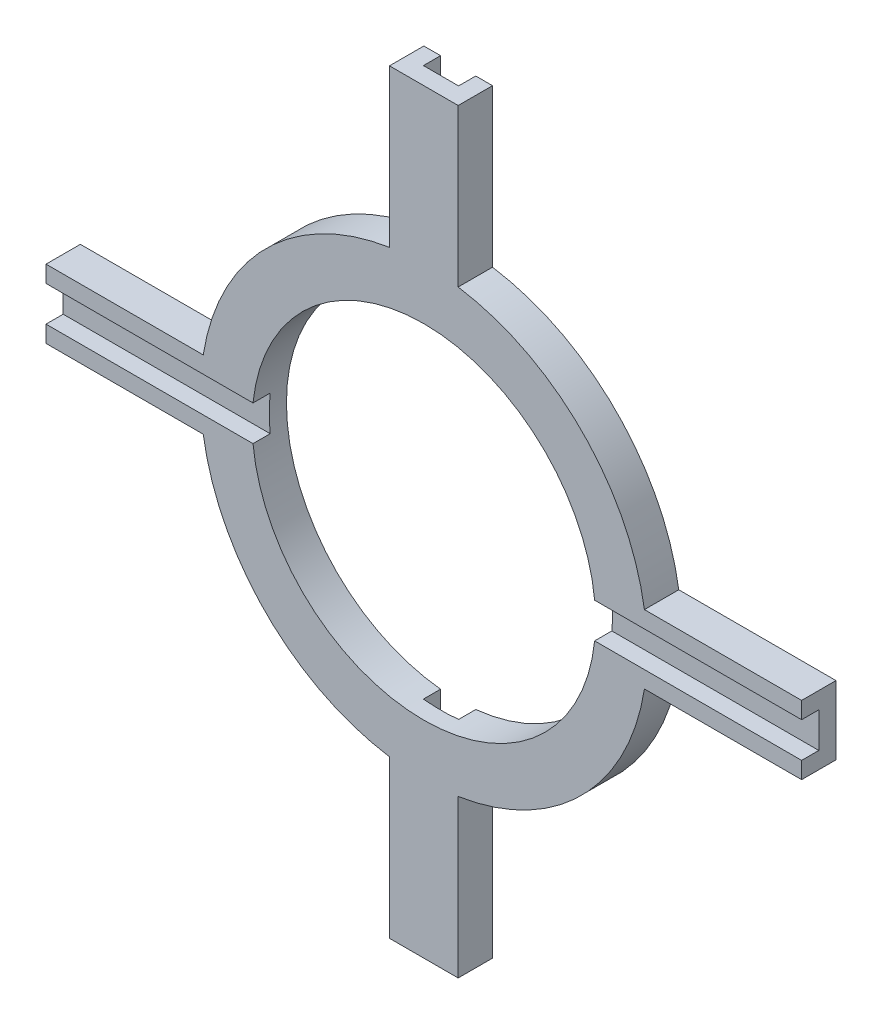
ISO-10303-21;
HEADER;
FILE_DESCRIPTION(('STEP AP214'),'2;1');
FILE_NAME('part.step','',(''),(''),'','','');
FILE_SCHEMA(('AUTOMOTIVE_DESIGN { 1 0 10303 214 1 1 1 1 }'));
ENDSEC;
DATA;
#1=APPLICATION_CONTEXT('core data for automotive mechanical design processes');
#2=APPLICATION_PROTOCOL_DEFINITION('international standard','automotive_design',2000,#1);
#3=PRODUCT_CONTEXT('',#1,'mechanical');
#4=PRODUCT('Part','Part','',(#3));
#5=PRODUCT_RELATED_PRODUCT_CATEGORY('part','',(#4));
#6=PRODUCT_DEFINITION_FORMATION('','',#4);
#7=PRODUCT_DEFINITION_CONTEXT('part definition',#1,'design');
#8=PRODUCT_DEFINITION('design','',#6,#7);
#9=PRODUCT_DEFINITION_SHAPE('','',#8);
#10=(LENGTH_UNIT() NAMED_UNIT(*) SI_UNIT(.MILLI.,.METRE.));
#11=(NAMED_UNIT(*) PLANE_ANGLE_UNIT() SI_UNIT($,.RADIAN.));
#12=(NAMED_UNIT(*) SI_UNIT($,.STERADIAN.) SOLID_ANGLE_UNIT());
#13=UNCERTAINTY_MEASURE_WITH_UNIT(LENGTH_MEASURE(1.E-05),#10,'distance_accuracy_value','');
#14=(GEOMETRIC_REPRESENTATION_CONTEXT(3) GLOBAL_UNCERTAINTY_ASSIGNED_CONTEXT((#13)) GLOBAL_UNIT_ASSIGNED_CONTEXT((#10,
#11,#12)) REPRESENTATION_CONTEXT('',''));
#15=CARTESIAN_POINT('',(0.,0.,0.));
#16=DIRECTION('',(0.,0.,1.));
#17=DIRECTION('',(1.,0.,0.));
#18=AXIS2_PLACEMENT_3D('',#15,#16,#17);
#19=CARTESIAN_POINT('',(0.,0.,4.));
#20=DIRECTION('',(0.,0.,1.));
#21=DIRECTION('',(1.,0.,0.));
#22=AXIS2_PLACEMENT_3D('',#19,#20,#21);
#23=PLANE('',#22);
#24=DIRECTION('',(1.,0.,0.));
#25=VECTOR('',#24,1.);
#26=CARTESIAN_POINT('',(-45.,-2.05,4.));
#27=LINE('',#26,#25);
#28=CARTESIAN_POINT('',(-44.,-2.05,4.));
#29=VERTEX_POINT('',#28);
#30=CARTESIAN_POINT('',(-19.8946600875712,-2.05,4.));
#31=VERTEX_POINT('',#30);
#32=EDGE_CURVE('E583',#29,#31,#27,.T.);
#33=ORIENTED_EDGE('',*,*,#32,.F.);
#34=DIRECTION('',(0.,-1.,0.));
#35=VECTOR('',#34,1.);
#36=CARTESIAN_POINT('',(-44.,-4.,4.));
#37=LINE('',#36,#35);
#38=CARTESIAN_POINT('',(-44.,-4.,4.));
#39=VERTEX_POINT('',#38);
#40=EDGE_CURVE('E359',#29,#39,#37,.T.);
#41=ORIENTED_EDGE('',*,*,#40,.T.);
#42=DIRECTION('',(1.,0.,0.));
#43=VECTOR('',#42,1.);
#44=CARTESIAN_POINT('',(-44.,-4.,4.));
#45=LINE('',#44,#43);
#46=CARTESIAN_POINT('',(-25.6904651573303,-4.,4.));
#47=VERTEX_POINT('',#46);
#48=EDGE_CURVE('E360',#39,#47,#45,.T.);
#49=ORIENTED_EDGE('',*,*,#48,.T.);
#50=CARTESIAN_POINT('',(0.,0.,4.));
#51=DIRECTION('',(0.,0.,1.));
#52=DIRECTION('',(1.,0.,0.));
#53=AXIS2_PLACEMENT_3D('',#50,#51,#52);
#54=CIRCLE('',#53,26.);
#55=CARTESIAN_POINT('',(-4.,-25.6904651573303,4.));
#56=VERTEX_POINT('',#55);
#57=EDGE_CURVE('E396',#47,#56,#54,.T.);
#58=ORIENTED_EDGE('',*,*,#57,.T.);
#59=DIRECTION('',(0.,-1.,0.));
#60=VECTOR('',#59,1.);
#61=CARTESIAN_POINT('',(-4.,-44.,4.));
#62=LINE('',#61,#60);
#63=CARTESIAN_POINT('',(-4.,-44.,4.));
#64=VERTEX_POINT('',#63);
#65=EDGE_CURVE('E320',#56,#64,#62,.T.);
#66=ORIENTED_EDGE('',*,*,#65,.T.);
#67=DIRECTION('',(1.,0.,0.));
#68=VECTOR('',#67,1.);
#69=CARTESIAN_POINT('',(-4.,-44.,4.));
#70=LINE('',#69,#68);
#71=CARTESIAN_POINT('',(4.,-44.,4.));
#72=VERTEX_POINT('',#71);
#73=EDGE_CURVE('E318',#64,#72,#70,.T.);
#74=ORIENTED_EDGE('',*,*,#73,.T.);
#75=DIRECTION('',(0.,1.,0.));
#76=VECTOR('',#75,1.);
#77=CARTESIAN_POINT('',(4.,-44.,4.));
#78=LINE('',#77,#76);
#79=CARTESIAN_POINT('',(4.,-25.6904651573303,4.));
#80=VERTEX_POINT('',#79);
#81=EDGE_CURVE('E321',#72,#80,#78,.T.);
#82=ORIENTED_EDGE('',*,*,#81,.T.);
#83=CARTESIAN_POINT('',(25.6904651573303,-4.,4.));
#84=VERTEX_POINT('',#83);
#85=EDGE_CURVE('E402',#80,#84,#54,.T.);
#86=ORIENTED_EDGE('',*,*,#85,.T.);
#87=DIRECTION('',(1.,0.,0.));
#88=VECTOR('',#87,1.);
#89=CARTESIAN_POINT('',(24.,-4.,4.));
#90=LINE('',#89,#88);
#91=CARTESIAN_POINT('',(44.,-4.,4.));
#92=VERTEX_POINT('',#91);
#93=EDGE_CURVE('E276',#84,#92,#90,.T.);
#94=ORIENTED_EDGE('',*,*,#93,.T.);
#95=DIRECTION('',(0.,1.,0.));
#96=VECTOR('',#95,1.);
#97=CARTESIAN_POINT('',(44.,-4.,4.));
#98=LINE('',#97,#96);
#99=CARTESIAN_POINT('',(44.,-2.05,4.));
#100=VERTEX_POINT('',#99);
#101=EDGE_CURVE('E279',#92,#100,#98,.T.);
#102=ORIENTED_EDGE('',*,*,#101,.T.);
#103=CARTESIAN_POINT('',(19.8946600875712,-2.05,4.));
#104=VERTEX_POINT('',#103);
#105=EDGE_CURVE('E435',#104,#100,#27,.T.);
#106=ORIENTED_EDGE('',*,*,#105,.F.);
#107=CARTESIAN_POINT('',(0.,0.,4.));
#108=DIRECTION('',(0.,0.,1.));
#109=DIRECTION('',(1.,0.,0.));
#110=AXIS2_PLACEMENT_3D('',#107,#108,#109);
#111=CIRCLE('',#110,20.);
#112=EDGE_CURVE('E393',#31,#104,#111,.T.);
#113=ORIENTED_EDGE('',*,*,#112,.F.);
#114=EDGE_LOOP('',(#33,#41,#49,#58,#66,#74,#82,#86,#94,#102,#106,#113));
#115=FACE_BOUND('',#114,.T.);
#116=ADVANCED_FACE('F41',(#115),#23,.T.);
#117=CARTESIAN_POINT('',(0.,0.,0.));
#118=DIRECTION('',(0.,0.,1.));
#119=DIRECTION('',(1.,0.,0.));
#120=AXIS2_PLACEMENT_3D('',#117,#118,#119);
#121=PLANE('',#120);
#122=DIRECTION('',(0.,1.,0.));
#123=VECTOR('',#122,1.);
#124=CARTESIAN_POINT('',(-2.05,45.,0.));
#125=LINE('',#124,#123);
#126=CARTESIAN_POINT('',(-2.05,-44.,0.));
#127=VERTEX_POINT('',#126);
#128=CARTESIAN_POINT('',(-2.05,-19.8946600875712,0.));
#129=VERTEX_POINT('',#128);
#130=EDGE_CURVE('E609',#127,#129,#125,.T.);
#131=ORIENTED_EDGE('',*,*,#130,.F.);
#132=DIRECTION('',(1.,0.,0.));
#133=VECTOR('',#132,1.);
#134=CARTESIAN_POINT('',(-4.,-44.,0.));
#135=LINE('',#134,#133);
#136=CARTESIAN_POINT('',(-4.,-44.,0.));
#137=VERTEX_POINT('',#136);
#138=EDGE_CURVE('E335',#137,#127,#135,.T.);
#139=ORIENTED_EDGE('',*,*,#138,.F.);
#140=DIRECTION('',(0.,-1.,0.));
#141=VECTOR('',#140,1.);
#142=CARTESIAN_POINT('',(-4.,-44.,0.));
#143=LINE('',#142,#141);
#144=CARTESIAN_POINT('',(-4.,-25.6904651573303,0.));
#145=VERTEX_POINT('',#144);
#146=EDGE_CURVE('E317',#145,#137,#143,.T.);
#147=ORIENTED_EDGE('',*,*,#146,.F.);
#148=CARTESIAN_POINT('',(0.,0.,0.));
#149=DIRECTION('',(0.,0.,1.));
#150=DIRECTION('',(1.,0.,0.));
#151=AXIS2_PLACEMENT_3D('',#148,#149,#150);
#152=CIRCLE('',#151,26.);
#153=CARTESIAN_POINT('',(-25.6904651573303,-4.,0.));
#154=VERTEX_POINT('',#153);
#155=EDGE_CURVE('E401',#154,#145,#152,.T.);
#156=ORIENTED_EDGE('',*,*,#155,.F.);
#157=DIRECTION('',(1.,0.,0.));
#158=VECTOR('',#157,1.);
#159=CARTESIAN_POINT('',(-44.,-4.,0.));
#160=LINE('',#159,#158);
#161=CARTESIAN_POINT('',(-44.,-4.,0.));
#162=VERTEX_POINT('',#161);
#163=EDGE_CURVE('E371',#162,#154,#160,.T.);
#164=ORIENTED_EDGE('',*,*,#163,.F.);
#165=DIRECTION('',(0.,-1.,0.));
#166=VECTOR('',#165,1.);
#167=CARTESIAN_POINT('',(-44.,-4.,0.));
#168=LINE('',#167,#166);
#169=CARTESIAN_POINT('',(-44.,4.,0.));
#170=VERTEX_POINT('',#169);
#171=EDGE_CURVE('E353',#170,#162,#168,.T.);
#172=ORIENTED_EDGE('',*,*,#171,.F.);
#173=DIRECTION('',(-1.,0.,0.));
#174=VECTOR('',#173,1.);
#175=CARTESIAN_POINT('',(-44.,4.,0.));
#176=LINE('',#175,#174);
#177=CARTESIAN_POINT('',(-25.6904651573303,4.,0.));
#178=VERTEX_POINT('',#177);
#179=EDGE_CURVE('E374',#178,#170,#176,.T.);
#180=ORIENTED_EDGE('',*,*,#179,.F.);
#181=CARTESIAN_POINT('',(-4.,25.6904651573303,0.));
#182=VERTEX_POINT('',#181);
#183=EDGE_CURVE('E388',#182,#178,#152,.T.);
#184=ORIENTED_EDGE('',*,*,#183,.F.);
#185=DIRECTION('',(0.,-1.,0.));
#186=VECTOR('',#185,1.);
#187=CARTESIAN_POINT('',(-4.,24.,0.));
#188=LINE('',#187,#186);
#189=CARTESIAN_POINT('',(-4.,44.,0.));
#190=VERTEX_POINT('',#189);
#191=EDGE_CURVE('E477',#190,#182,#188,.T.);
#192=ORIENTED_EDGE('',*,*,#191,.F.);
#193=DIRECTION('',(-1.,0.,0.));
#194=VECTOR('',#193,1.);
#195=CARTESIAN_POINT('',(-4.,44.,0.));
#196=LINE('',#195,#194);
#197=CARTESIAN_POINT('',(-2.05,44.,0.));
#198=VERTEX_POINT('',#197);
#199=EDGE_CURVE('E486',#198,#190,#196,.T.);
#200=ORIENTED_EDGE('',*,*,#199,.F.);
#201=CARTESIAN_POINT('',(-2.05,19.8946600875712,0.));
#202=VERTEX_POINT('',#201);
#203=EDGE_CURVE('E614',#202,#198,#125,.T.);
#204=ORIENTED_EDGE('',*,*,#203,.F.);
#205=CARTESIAN_POINT('',(0.,0.,0.));
#206=DIRECTION('',(0.,0.,1.));
#207=DIRECTION('',(1.,0.,0.));
#208=AXIS2_PLACEMENT_3D('',#205,#206,#207);
#209=CIRCLE('',#208,20.);
#210=EDGE_CURVE('E392',#202,#129,#209,.T.);
#211=ORIENTED_EDGE('',*,*,#210,.T.);
#212=EDGE_LOOP('',(#131,#139,#147,#156,#164,#172,#180,#184,#192,#200,#204,#211));
#213=FACE_BOUND('',#212,.T.);
#214=ADVANCED_FACE('F511',(#213),#121,.F.);
#215=DIRECTION('',(0.,-1.,0.));
#216=VECTOR('',#215,1.);
#217=CARTESIAN_POINT('',(2.05,-45.,0.));
#218=LINE('',#217,#216);
#219=CARTESIAN_POINT('',(2.05,44.,0.));
#220=VERTEX_POINT('',#219);
#221=CARTESIAN_POINT('',(2.05,19.8946600875712,0.));
#222=VERTEX_POINT('',#221);
#223=EDGE_CURVE('E619',#220,#222,#218,.T.);
#224=ORIENTED_EDGE('',*,*,#223,.F.);
#225=CARTESIAN_POINT('',(4.,44.,0.));
#226=VERTEX_POINT('',#225);
#227=EDGE_CURVE('E478',#226,#220,#196,.T.);
#228=ORIENTED_EDGE('',*,*,#227,.F.);
#229=DIRECTION('',(0.,1.,0.));
#230=VECTOR('',#229,1.);
#231=CARTESIAN_POINT('',(4.,24.,0.));
#232=LINE('',#231,#230);
#233=CARTESIAN_POINT('',(4.,25.6904651573303,0.));
#234=VERTEX_POINT('',#233);
#235=EDGE_CURVE('E483',#234,#226,#232,.T.);
#236=ORIENTED_EDGE('',*,*,#235,.F.);
#237=CARTESIAN_POINT('',(25.6904651573303,4.,0.));
#238=VERTEX_POINT('',#237);
#239=EDGE_CURVE('E449',#238,#234,#152,.T.);
#240=ORIENTED_EDGE('',*,*,#239,.F.);
#241=DIRECTION('',(-1.,0.,0.));
#242=VECTOR('',#241,1.);
#243=CARTESIAN_POINT('',(24.,4.,0.));
#244=LINE('',#243,#242);
#245=CARTESIAN_POINT('',(44.,4.,0.));
#246=VERTEX_POINT('',#245);
#247=EDGE_CURVE('E286',#246,#238,#244,.T.);
#248=ORIENTED_EDGE('',*,*,#247,.F.);
#249=DIRECTION('',(0.,1.,0.));
#250=VECTOR('',#249,1.);
#251=CARTESIAN_POINT('',(44.,-4.,0.));
#252=LINE('',#251,#250);
#253=CARTESIAN_POINT('',(44.,-4.,0.));
#254=VERTEX_POINT('',#253);
#255=EDGE_CURVE('E294',#254,#246,#252,.T.);
#256=ORIENTED_EDGE('',*,*,#255,.F.);
#257=DIRECTION('',(1.,0.,0.));
#258=VECTOR('',#257,1.);
#259=CARTESIAN_POINT('',(24.,-4.,0.));
#260=LINE('',#259,#258);
#261=CARTESIAN_POINT('',(25.6904651573303,-4.,0.));
#262=VERTEX_POINT('',#261);
#263=EDGE_CURVE('E292',#262,#254,#260,.T.);
#264=ORIENTED_EDGE('',*,*,#263,.F.);
#265=CARTESIAN_POINT('',(4.,-25.6904651573303,0.));
#266=VERTEX_POINT('',#265);
#267=EDGE_CURVE('E407',#266,#262,#152,.T.);
#268=ORIENTED_EDGE('',*,*,#267,.F.);
#269=DIRECTION('',(0.,1.,0.));
#270=VECTOR('',#269,1.);
#271=CARTESIAN_POINT('',(4.,-44.,0.));
#272=LINE('',#271,#270);
#273=CARTESIAN_POINT('',(4.,-44.,0.));
#274=VERTEX_POINT('',#273);
#275=EDGE_CURVE('E322',#274,#266,#272,.T.);
#276=ORIENTED_EDGE('',*,*,#275,.F.);
#277=CARTESIAN_POINT('',(2.05,-44.,0.));
#278=VERTEX_POINT('',#277);
#279=EDGE_CURVE('E331',#278,#274,#135,.T.);
#280=ORIENTED_EDGE('',*,*,#279,.F.);
#281=CARTESIAN_POINT('',(2.05,-19.8946600875712,0.));
#282=VERTEX_POINT('',#281);
#283=EDGE_CURVE('E613',#282,#278,#218,.T.);
#284=ORIENTED_EDGE('',*,*,#283,.F.);
#285=EDGE_CURVE('E383',#282,#222,#209,.T.);
#286=ORIENTED_EDGE('',*,*,#285,.T.);
#287=EDGE_LOOP('',(#224,#228,#236,#240,#248,#256,#264,#268,#276,#280,#284,#286));
#288=FACE_BOUND('',#287,.T.);
#289=ADVANCED_FACE('F443',(#288),#121,.F.);
#290=CARTESIAN_POINT('',(0.,0.,4.));
#291=DIRECTION('',(0.,0.,-1.));
#292=DIRECTION('',(-1.,0.,0.));
#293=AXIS2_PLACEMENT_3D('',#290,#291,#292);
#294=CYLINDRICAL_SURFACE('',#293,26.);
#295=DIRECTION('',(0.,0.,-1.));
#296=VECTOR('',#295,1.);
#297=CARTESIAN_POINT('',(-4.,25.6904651573303,4.));
#298=LINE('',#297,#296);
#299=CARTESIAN_POINT('',(-4.,25.6904651573303,4.));
#300=VERTEX_POINT('',#299);
#301=EDGE_CURVE('E298',#182,#300,#298,.F.);
#302=ORIENTED_EDGE('',*,*,#301,.F.);
#303=ORIENTED_EDGE('',*,*,#183,.T.);
#304=DIRECTION('',(0.,0.,-1.));
#305=VECTOR('',#304,1.);
#306=CARTESIAN_POINT('',(-25.6904651573303,4.,4.));
#307=LINE('',#306,#305);
#308=CARTESIAN_POINT('',(-25.6904651573303,4.,4.));
#309=VERTEX_POINT('',#308);
#310=EDGE_CURVE('E399',#309,#178,#307,.T.);
#311=ORIENTED_EDGE('',*,*,#310,.F.);
#312=EDGE_CURVE('E405',#300,#309,#54,.T.);
#313=ORIENTED_EDGE('',*,*,#312,.F.);
#314=EDGE_LOOP('',(#302,#303,#311,#313));
#315=FACE_BOUND('',#314,.T.);
#316=ADVANCED_FACE('F734',(#315),#294,.T.);
#317=DIRECTION('',(0.,0.,-1.));
#318=VECTOR('',#317,1.);
#319=CARTESIAN_POINT('',(4.,25.6904651573303,4.));
#320=LINE('',#319,#318);
#321=CARTESIAN_POINT('',(4.,25.6904651573303,4.));
#322=VERTEX_POINT('',#321);
#323=EDGE_CURVE('E465',#322,#234,#320,.T.);
#324=ORIENTED_EDGE('',*,*,#323,.F.);
#325=CARTESIAN_POINT('',(25.6904651573303,4.,4.));
#326=VERTEX_POINT('',#325);
#327=EDGE_CURVE('E454',#326,#322,#54,.T.);
#328=ORIENTED_EDGE('',*,*,#327,.F.);
#329=DIRECTION('',(0.,0.,-1.));
#330=VECTOR('',#329,1.);
#331=CARTESIAN_POINT('',(25.6904651573303,4.,4.));
#332=LINE('',#331,#330);
#333=EDGE_CURVE('E308',#238,#326,#332,.F.);
#334=ORIENTED_EDGE('',*,*,#333,.F.);
#335=ORIENTED_EDGE('',*,*,#239,.T.);
#336=EDGE_LOOP('',(#324,#328,#334,#335));
#337=FACE_BOUND('',#336,.T.);
#338=ADVANCED_FACE('F739',(#337),#294,.T.);
#339=DIRECTION('',(0.,0.,-1.));
#340=VECTOR('',#339,1.);
#341=CARTESIAN_POINT('',(25.6904651573303,-4.,4.));
#342=LINE('',#341,#340);
#343=EDGE_CURVE('E315',#84,#262,#342,.T.);
#344=ORIENTED_EDGE('',*,*,#343,.F.);
#345=ORIENTED_EDGE('',*,*,#85,.F.);
#346=DIRECTION('',(0.,0.,-1.));
#347=VECTOR('',#346,1.);
#348=CARTESIAN_POINT('',(4.,-25.6904651573303,4.));
#349=LINE('',#348,#347);
#350=EDGE_CURVE('E348',#266,#80,#349,.F.);
#351=ORIENTED_EDGE('',*,*,#350,.F.);
#352=ORIENTED_EDGE('',*,*,#267,.T.);
#353=EDGE_LOOP('',(#344,#345,#351,#352));
#354=FACE_BOUND('',#353,.T.);
#355=ADVANCED_FACE('F522',(#354),#294,.T.);
#356=DIRECTION('',(0.,0.,-1.));
#357=VECTOR('',#356,1.);
#358=CARTESIAN_POINT('',(-4.,-25.6904651573303,4.));
#359=LINE('',#358,#357);
#360=EDGE_CURVE('E347',#56,#145,#359,.T.);
#361=ORIENTED_EDGE('',*,*,#360,.F.);
#362=ORIENTED_EDGE('',*,*,#57,.F.);
#363=DIRECTION('',(0.,0.,-1.));
#364=VECTOR('',#363,1.);
#365=CARTESIAN_POINT('',(-25.6904651573303,-4.,4.));
#366=LINE('',#365,#364);
#367=EDGE_CURVE('E408',#154,#47,#366,.F.);
#368=ORIENTED_EDGE('',*,*,#367,.F.);
#369=ORIENTED_EDGE('',*,*,#155,.T.);
#370=EDGE_LOOP('',(#361,#362,#368,#369));
#371=FACE_BOUND('',#370,.T.);
#372=ADVANCED_FACE('F43',(#371),#294,.T.);
#373=DIRECTION('',(-1.,0.,0.));
#374=VECTOR('',#373,1.);
#375=CARTESIAN_POINT('',(45.,2.05,4.));
#376=LINE('',#375,#374);
#377=CARTESIAN_POINT('',(44.,2.05,4.));
#378=VERTEX_POINT('',#377);
#379=CARTESIAN_POINT('',(19.8946600875712,2.05,4.));
#380=VERTEX_POINT('',#379);
#381=EDGE_CURVE('E691',#378,#380,#376,.T.);
#382=ORIENTED_EDGE('',*,*,#381,.F.);
#383=CARTESIAN_POINT('',(44.,4.,4.));
#384=VERTEX_POINT('',#383);
#385=EDGE_CURVE('E272',#378,#384,#98,.T.);
#386=ORIENTED_EDGE('',*,*,#385,.T.);
#387=DIRECTION('',(-1.,0.,0.));
#388=VECTOR('',#387,1.);
#389=CARTESIAN_POINT('',(24.,4.,4.));
#390=LINE('',#389,#388);
#391=EDGE_CURVE('E282',#384,#326,#390,.T.);
#392=ORIENTED_EDGE('',*,*,#391,.T.);
#393=ORIENTED_EDGE('',*,*,#327,.T.);
#394=DIRECTION('',(0.,1.,0.));
#395=VECTOR('',#394,1.);
#396=CARTESIAN_POINT('',(4.,24.,4.));
#397=LINE('',#396,#395);
#398=CARTESIAN_POINT('',(4.,44.,4.));
#399=VERTEX_POINT('',#398);
#400=EDGE_CURVE('E453',#322,#399,#397,.T.);
#401=ORIENTED_EDGE('',*,*,#400,.T.);
#402=DIRECTION('',(-1.,0.,0.));
#403=VECTOR('',#402,1.);
#404=CARTESIAN_POINT('',(-4.,44.,4.));
#405=LINE('',#404,#403);
#406=CARTESIAN_POINT('',(-4.,44.,4.));
#407=VERTEX_POINT('',#406);
#408=EDGE_CURVE('E470',#399,#407,#405,.T.);
#409=ORIENTED_EDGE('',*,*,#408,.T.);
#410=DIRECTION('',(0.,-1.,0.));
#411=VECTOR('',#410,1.);
#412=CARTESIAN_POINT('',(-4.,24.,4.));
#413=LINE('',#412,#411);
#414=EDGE_CURVE('E466',#407,#300,#413,.T.);
#415=ORIENTED_EDGE('',*,*,#414,.T.);
#416=ORIENTED_EDGE('',*,*,#312,.T.);
#417=DIRECTION('',(-1.,0.,0.));
#418=VECTOR('',#417,1.);
#419=CARTESIAN_POINT('',(-44.,4.,4.));
#420=LINE('',#419,#418);
#421=CARTESIAN_POINT('',(-44.,4.,4.));
#422=VERTEX_POINT('',#421);
#423=EDGE_CURVE('E364',#309,#422,#420,.T.);
#424=ORIENTED_EDGE('',*,*,#423,.T.);
#425=CARTESIAN_POINT('',(-44.,2.05,4.));
#426=VERTEX_POINT('',#425);
#427=EDGE_CURVE('E354',#422,#426,#37,.T.);
#428=ORIENTED_EDGE('',*,*,#427,.T.);
#429=CARTESIAN_POINT('',(-19.8946600875712,2.05,4.));
#430=VERTEX_POINT('',#429);
#431=EDGE_CURVE('E587',#430,#426,#376,.T.);
#432=ORIENTED_EDGE('',*,*,#431,.F.);
#433=EDGE_CURVE('E387',#380,#430,#111,.T.);
#434=ORIENTED_EDGE('',*,*,#433,.F.);
#435=EDGE_LOOP('',(#382,#386,#392,#393,#401,#409,#415,#416,#424,#428,#432,#434));
#436=FACE_BOUND('',#435,.T.);
#437=ADVANCED_FACE('F455',(#436),#23,.T.);
#438=CARTESIAN_POINT('',(0.,0.,4.));
#439=DIRECTION('',(0.,0.,-1.));
#440=DIRECTION('',(-1.,0.,0.));
#441=AXIS2_PLACEMENT_3D('',#438,#439,#440);
#442=CYLINDRICAL_SURFACE('',#441,20.);
#443=DIRECTION('',(0.,0.,-1.));
#444=VECTOR('',#443,1.);
#445=CARTESIAN_POINT('',(-19.8946600875712,2.05,4.));
#446=LINE('',#445,#444);
#447=CARTESIAN_POINT('',(-19.8946600875712,2.05,2.));
#448=VERTEX_POINT('',#447);
#449=EDGE_CURVE('E673',#448,#430,#446,.F.);
#450=ORIENTED_EDGE('',*,*,#449,.F.);
#451=CARTESIAN_POINT('',(0.,0.,2.));
#452=DIRECTION('',(0.,0.,1.));
#453=DIRECTION('',(1.,0.,0.));
#454=AXIS2_PLACEMENT_3D('',#451,#452,#453);
#455=CIRCLE('',#454,20.);
#456=CARTESIAN_POINT('',(-19.8946600875712,-2.05,2.));
#457=VERTEX_POINT('',#456);
#458=EDGE_CURVE('E685',#448,#457,#455,.T.);
#459=ORIENTED_EDGE('',*,*,#458,.T.);
#460=DIRECTION('',(0.,0.,-1.));
#461=VECTOR('',#460,1.);
#462=CARTESIAN_POINT('',(-19.8946600875712,-2.05,4.));
#463=LINE('',#462,#461);
#464=EDGE_CURVE('E581',#31,#457,#463,.T.);
#465=ORIENTED_EDGE('',*,*,#464,.F.);
#466=ORIENTED_EDGE('',*,*,#112,.T.);
#467=DIRECTION('',(0.,0.,-1.));
#468=VECTOR('',#467,1.);
#469=CARTESIAN_POINT('',(19.8946600875712,-2.05,4.));
#470=LINE('',#469,#468);
#471=CARTESIAN_POINT('',(19.8946600875712,-2.05,2.));
#472=VERTEX_POINT('',#471);
#473=EDGE_CURVE('E585',#472,#104,#470,.F.);
#474=ORIENTED_EDGE('',*,*,#473,.F.);
#475=CARTESIAN_POINT('',(19.8946600875712,2.05,2.));
#476=VERTEX_POINT('',#475);
#477=EDGE_CURVE('E684',#472,#476,#455,.T.);
#478=ORIENTED_EDGE('',*,*,#477,.T.);
#479=DIRECTION('',(0.,0.,-1.));
#480=VECTOR('',#479,1.);
#481=CARTESIAN_POINT('',(19.8946600875712,2.05,4.));
#482=LINE('',#481,#480);
#483=EDGE_CURVE('E264',#380,#476,#482,.T.);
#484=ORIENTED_EDGE('',*,*,#483,.F.);
#485=ORIENTED_EDGE('',*,*,#433,.T.);
#486=EDGE_LOOP('',(#450,#459,#465,#466,#474,#478,#484,#485));
#487=FACE_BOUND('',#486,.T.);
#488=DIRECTION('',(0.,0.,-1.));
#489=VECTOR('',#488,1.);
#490=CARTESIAN_POINT('',(-2.05,19.8946600875712,4.));
#491=LINE('',#490,#489);
#492=CARTESIAN_POINT('',(-2.05,19.8946600875712,2.));
#493=VERTEX_POINT('',#492);
#494=EDGE_CURVE('E484',#493,#202,#491,.T.);
#495=ORIENTED_EDGE('',*,*,#494,.F.);
#496=CARTESIAN_POINT('',(0.,0.,2.));
#497=DIRECTION('',(0.,0.,1.));
#498=DIRECTION('',(1.,0.,0.));
#499=AXIS2_PLACEMENT_3D('',#496,#497,#498);
#500=CIRCLE('',#499,20.);
#501=CARTESIAN_POINT('',(2.05,19.8946600875712,2.));
#502=VERTEX_POINT('',#501);
#503=EDGE_CURVE('E633',#502,#493,#500,.T.);
#504=ORIENTED_EDGE('',*,*,#503,.F.);
#505=DIRECTION('',(0.,0.,-1.));
#506=VECTOR('',#505,1.);
#507=CARTESIAN_POINT('',(2.05,19.8946600875712,4.));
#508=LINE('',#507,#506);
#509=EDGE_CURVE('E636',#222,#502,#508,.F.);
#510=ORIENTED_EDGE('',*,*,#509,.F.);
#511=ORIENTED_EDGE('',*,*,#285,.F.);
#512=DIRECTION('',(0.,0.,-1.));
#513=VECTOR('',#512,1.);
#514=CARTESIAN_POINT('',(2.05,-19.8946600875712,4.));
#515=LINE('',#514,#513);
#516=CARTESIAN_POINT('',(2.05,-19.8946600875712,2.));
#517=VERTEX_POINT('',#516);
#518=EDGE_CURVE('E638',#517,#282,#515,.T.);
#519=ORIENTED_EDGE('',*,*,#518,.F.);
#520=CARTESIAN_POINT('',(-2.05,-19.8946600875712,2.));
#521=VERTEX_POINT('',#520);
#522=EDGE_CURVE('E627',#521,#517,#500,.T.);
#523=ORIENTED_EDGE('',*,*,#522,.F.);
#524=DIRECTION('',(0.,0.,-1.));
#525=VECTOR('',#524,1.);
#526=CARTESIAN_POINT('',(-2.05,-19.8946600875712,4.));
#527=LINE('',#526,#525);
#528=EDGE_CURVE('E641',#129,#521,#527,.F.);
#529=ORIENTED_EDGE('',*,*,#528,.F.);
#530=ORIENTED_EDGE('',*,*,#210,.F.);
#531=EDGE_LOOP('',(#495,#504,#510,#511,#519,#523,#529,#530));
#532=FACE_BOUND('',#531,.T.);
#533=ADVANCED_FACE('F578',(#487,#532),#442,.F.);
#534=CARTESIAN_POINT('',(-44.,-4.,4.));
#535=DIRECTION('',(0.,1.,0.));
#536=DIRECTION('',(0.,0.,1.));
#537=AXIS2_PLACEMENT_3D('',#534,#535,#536);
#538=PLANE('',#537);
#539=ORIENTED_EDGE('',*,*,#163,.T.);
#540=ORIENTED_EDGE('',*,*,#367,.T.);
#541=ORIENTED_EDGE('',*,*,#48,.F.);
#542=DIRECTION('',(0.,0.,-1.));
#543=VECTOR('',#542,1.);
#544=CARTESIAN_POINT('',(-44.,-4.,4.));
#545=LINE('',#544,#543);
#546=EDGE_CURVE('E382',#39,#162,#545,.T.);
#547=ORIENTED_EDGE('',*,*,#546,.T.);
#548=EDGE_LOOP('',(#539,#540,#541,#547));
#549=FACE_BOUND('',#548,.T.);
#550=ADVANCED_FACE('F599',(#549),#538,.F.);
#551=CARTESIAN_POINT('',(-44.,4.,4.));
#552=DIRECTION('',(0.,-1.,0.));
#553=DIRECTION('',(0.,0.,-1.));
#554=AXIS2_PLACEMENT_3D('',#551,#552,#553);
#555=PLANE('',#554);
#556=ORIENTED_EDGE('',*,*,#423,.F.);
#557=ORIENTED_EDGE('',*,*,#310,.T.);
#558=ORIENTED_EDGE('',*,*,#179,.T.);
#559=DIRECTION('',(0.,0.,-1.));
#560=VECTOR('',#559,1.);
#561=CARTESIAN_POINT('',(-44.,4.,4.));
#562=LINE('',#561,#560);
#563=EDGE_CURVE('E370',#422,#170,#562,.T.);
#564=ORIENTED_EDGE('',*,*,#563,.F.);
#565=EDGE_LOOP('',(#556,#557,#558,#564));
#566=FACE_BOUND('',#565,.T.);
#567=ADVANCED_FACE('F879',(#566),#555,.F.);
#568=CARTESIAN_POINT('',(-44.,-4.,4.));
#569=DIRECTION('',(1.,0.,0.));
#570=DIRECTION('',(0.,0.,-1.));
#571=AXIS2_PLACEMENT_3D('',#568,#569,#570);
#572=PLANE('',#571);
#573=DIRECTION('',(0.,-1.,0.));
#574=VECTOR('',#573,1.);
#575=CARTESIAN_POINT('',(-44.,-4.,2.));
#576=LINE('',#575,#574);
#577=CARTESIAN_POINT('',(-44.,2.05,2.));
#578=VERTEX_POINT('',#577);
#579=CARTESIAN_POINT('',(-44.,-2.05,2.));
#580=VERTEX_POINT('',#579);
#581=EDGE_CURVE('E266',#578,#580,#576,.T.);
#582=ORIENTED_EDGE('',*,*,#581,.F.);
#583=DIRECTION('',(0.,0.,1.));
#584=VECTOR('',#583,1.);
#585=CARTESIAN_POINT('',(-44.,2.05,4.));
#586=LINE('',#585,#584);
#587=EDGE_CURVE('E674',#578,#426,#586,.T.);
#588=ORIENTED_EDGE('',*,*,#587,.T.);
#589=ORIENTED_EDGE('',*,*,#427,.F.);
#590=ORIENTED_EDGE('',*,*,#563,.T.);
#591=ORIENTED_EDGE('',*,*,#171,.T.);
#592=ORIENTED_EDGE('',*,*,#546,.F.);
#593=ORIENTED_EDGE('',*,*,#40,.F.);
#594=DIRECTION('',(0.,0.,-1.));
#595=VECTOR('',#594,1.);
#596=CARTESIAN_POINT('',(-44.,-2.05,4.));
#597=LINE('',#596,#595);
#598=EDGE_CURVE('E600',#29,#580,#597,.T.);
#599=ORIENTED_EDGE('',*,*,#598,.T.);
#600=EDGE_LOOP('',(#582,#588,#589,#590,#591,#592,#593,#599));
#601=FACE_BOUND('',#600,.T.);
#602=ADVANCED_FACE('F597',(#601),#572,.F.);
#603=CARTESIAN_POINT('',(-4.,-44.,4.));
#604=DIRECTION('',(1.,0.,0.));
#605=DIRECTION('',(0.,0.,-1.));
#606=AXIS2_PLACEMENT_3D('',#603,#604,#605);
#607=PLANE('',#606);
#608=ORIENTED_EDGE('',*,*,#65,.F.);
#609=ORIENTED_EDGE('',*,*,#360,.T.);
#610=ORIENTED_EDGE('',*,*,#146,.T.);
#611=DIRECTION('',(0.,0.,-1.));
#612=VECTOR('',#611,1.);
#613=CARTESIAN_POINT('',(-4.,-44.,4.));
#614=LINE('',#613,#612);
#615=EDGE_CURVE('E345',#64,#137,#614,.T.);
#616=ORIENTED_EDGE('',*,*,#615,.F.);
#617=EDGE_LOOP('',(#608,#609,#610,#616));
#618=FACE_BOUND('',#617,.T.);
#619=ADVANCED_FACE('F604',(#618),#607,.F.);
#620=CARTESIAN_POINT('',(4.,-44.,4.));
#621=DIRECTION('',(-1.,0.,0.));
#622=DIRECTION('',(0.,0.,1.));
#623=AXIS2_PLACEMENT_3D('',#620,#621,#622);
#624=PLANE('',#623);
#625=ORIENTED_EDGE('',*,*,#275,.T.);
#626=ORIENTED_EDGE('',*,*,#350,.T.);
#627=ORIENTED_EDGE('',*,*,#81,.F.);
#628=DIRECTION('',(0.,0.,-1.));
#629=VECTOR('',#628,1.);
#630=CARTESIAN_POINT('',(4.,-44.,4.));
#631=LINE('',#630,#629);
#632=EDGE_CURVE('E326',#72,#274,#631,.T.);
#633=ORIENTED_EDGE('',*,*,#632,.T.);
#634=EDGE_LOOP('',(#625,#626,#627,#633));
#635=FACE_BOUND('',#634,.T.);
#636=ADVANCED_FACE('F528',(#635),#624,.F.);
#637=CARTESIAN_POINT('',(-4.,-44.,4.));
#638=DIRECTION('',(0.,1.,0.));
#639=DIRECTION('',(0.,0.,1.));
#640=AXIS2_PLACEMENT_3D('',#637,#638,#639);
#641=PLANE('',#640);
#642=ORIENTED_EDGE('',*,*,#138,.T.);
#643=DIRECTION('',(0.,0.,1.));
#644=VECTOR('',#643,1.);
#645=CARTESIAN_POINT('',(-2.05,-44.,4.));
#646=LINE('',#645,#644);
#647=CARTESIAN_POINT('',(-2.05,-44.,2.));
#648=VERTEX_POINT('',#647);
#649=EDGE_CURVE('E610',#127,#648,#646,.T.);
#650=ORIENTED_EDGE('',*,*,#649,.T.);
#651=DIRECTION('',(1.,0.,0.));
#652=VECTOR('',#651,1.);
#653=CARTESIAN_POINT('',(-4.,-44.,2.));
#654=LINE('',#653,#652);
#655=CARTESIAN_POINT('',(2.05,-44.,2.));
#656=VERTEX_POINT('',#655);
#657=EDGE_CURVE('E626',#648,#656,#654,.T.);
#658=ORIENTED_EDGE('',*,*,#657,.T.);
#659=DIRECTION('',(0.,0.,-1.));
#660=VECTOR('',#659,1.);
#661=CARTESIAN_POINT('',(2.05,-44.,4.));
#662=LINE('',#661,#660);
#663=EDGE_CURVE('E536',#656,#278,#662,.T.);
#664=ORIENTED_EDGE('',*,*,#663,.T.);
#665=ORIENTED_EDGE('',*,*,#279,.T.);
#666=ORIENTED_EDGE('',*,*,#632,.F.);
#667=ORIENTED_EDGE('',*,*,#73,.F.);
#668=ORIENTED_EDGE('',*,*,#615,.T.);
#669=EDGE_LOOP('',(#642,#650,#658,#664,#665,#666,#667,#668));
#670=FACE_BOUND('',#669,.T.);
#671=ADVANCED_FACE('F534',(#670),#641,.F.);
#672=CARTESIAN_POINT('',(24.,-4.,4.));
#673=DIRECTION('',(0.,1.,0.));
#674=DIRECTION('',(0.,0.,1.));
#675=AXIS2_PLACEMENT_3D('',#672,#673,#674);
#676=PLANE('',#675);
#677=ORIENTED_EDGE('',*,*,#93,.F.);
#678=ORIENTED_EDGE('',*,*,#343,.T.);
#679=ORIENTED_EDGE('',*,*,#263,.T.);
#680=DIRECTION('',(0.,0.,-1.));
#681=VECTOR('',#680,1.);
#682=CARTESIAN_POINT('',(44.,-4.,4.));
#683=LINE('',#682,#681);
#684=EDGE_CURVE('E302',#92,#254,#683,.T.);
#685=ORIENTED_EDGE('',*,*,#684,.F.);
#686=EDGE_LOOP('',(#677,#678,#679,#685));
#687=FACE_BOUND('',#686,.T.);
#688=ADVANCED_FACE('F438',(#687),#676,.F.);
#689=CARTESIAN_POINT('',(24.,4.,4.));
#690=DIRECTION('',(0.,-1.,0.));
#691=DIRECTION('',(0.,0.,-1.));
#692=AXIS2_PLACEMENT_3D('',#689,#690,#691);
#693=PLANE('',#692);
#694=ORIENTED_EDGE('',*,*,#247,.T.);
#695=ORIENTED_EDGE('',*,*,#333,.T.);
#696=ORIENTED_EDGE('',*,*,#391,.F.);
#697=DIRECTION('',(0.,0.,-1.));
#698=VECTOR('',#697,1.);
#699=CARTESIAN_POINT('',(44.,4.,4.));
#700=LINE('',#699,#698);
#701=EDGE_CURVE('E271',#384,#246,#700,.T.);
#702=ORIENTED_EDGE('',*,*,#701,.T.);
#703=EDGE_LOOP('',(#694,#695,#696,#702));
#704=FACE_BOUND('',#703,.T.);
#705=ADVANCED_FACE('F448',(#704),#693,.F.);
#706=CARTESIAN_POINT('',(44.,-4.,4.));
#707=DIRECTION('',(-1.,0.,0.));
#708=DIRECTION('',(0.,0.,1.));
#709=AXIS2_PLACEMENT_3D('',#706,#707,#708);
#710=PLANE('',#709);
#711=ORIENTED_EDGE('',*,*,#385,.F.);
#712=DIRECTION('',(0.,0.,-1.));
#713=VECTOR('',#712,1.);
#714=CARTESIAN_POINT('',(44.,2.05,4.));
#715=LINE('',#714,#713);
#716=CARTESIAN_POINT('',(44.,2.05,2.));
#717=VERTEX_POINT('',#716);
#718=EDGE_CURVE('E11',#378,#717,#715,.T.);
#719=ORIENTED_EDGE('',*,*,#718,.T.);
#720=DIRECTION('',(0.,1.,0.));
#721=VECTOR('',#720,1.);
#722=CARTESIAN_POINT('',(44.,-4.,2.));
#723=LINE('',#722,#721);
#724=CARTESIAN_POINT('',(44.,-2.05,2.));
#725=VERTEX_POINT('',#724);
#726=EDGE_CURVE('E249',#725,#717,#723,.T.);
#727=ORIENTED_EDGE('',*,*,#726,.F.);
#728=DIRECTION('',(0.,0.,1.));
#729=VECTOR('',#728,1.);
#730=CARTESIAN_POINT('',(44.,-2.05,4.));
#731=LINE('',#730,#729);
#732=EDGE_CURVE('E49',#725,#100,#731,.T.);
#733=ORIENTED_EDGE('',*,*,#732,.T.);
#734=ORIENTED_EDGE('',*,*,#101,.F.);
#735=ORIENTED_EDGE('',*,*,#684,.T.);
#736=ORIENTED_EDGE('',*,*,#255,.T.);
#737=ORIENTED_EDGE('',*,*,#701,.F.);
#738=EDGE_LOOP('',(#711,#719,#727,#733,#734,#735,#736,#737));
#739=FACE_BOUND('',#738,.T.);
#740=ADVANCED_FACE('F268',(#739),#710,.F.);
#741=CARTESIAN_POINT('',(-4.,24.,4.));
#742=DIRECTION('',(1.,0.,0.));
#743=DIRECTION('',(0.,0.,-1.));
#744=AXIS2_PLACEMENT_3D('',#741,#742,#743);
#745=PLANE('',#744);
#746=ORIENTED_EDGE('',*,*,#191,.T.);
#747=ORIENTED_EDGE('',*,*,#301,.T.);
#748=ORIENTED_EDGE('',*,*,#414,.F.);
#749=DIRECTION('',(0.,0.,-1.));
#750=VECTOR('',#749,1.);
#751=CARTESIAN_POINT('',(-4.,44.,4.));
#752=LINE('',#751,#750);
#753=EDGE_CURVE('E474',#407,#190,#752,.T.);
#754=ORIENTED_EDGE('',*,*,#753,.T.);
#755=EDGE_LOOP('',(#746,#747,#748,#754));
#756=FACE_BOUND('',#755,.T.);
#757=ADVANCED_FACE('F503',(#756),#745,.F.);
#758=CARTESIAN_POINT('',(4.,24.,4.));
#759=DIRECTION('',(-1.,0.,0.));
#760=DIRECTION('',(0.,0.,1.));
#761=AXIS2_PLACEMENT_3D('',#758,#759,#760);
#762=PLANE('',#761);
#763=ORIENTED_EDGE('',*,*,#400,.F.);
#764=ORIENTED_EDGE('',*,*,#323,.T.);
#765=ORIENTED_EDGE('',*,*,#235,.T.);
#766=DIRECTION('',(0.,0.,-1.));
#767=VECTOR('',#766,1.);
#768=CARTESIAN_POINT('',(4.,44.,4.));
#769=LINE('',#768,#767);
#770=EDGE_CURVE('E463',#399,#226,#769,.T.);
#771=ORIENTED_EDGE('',*,*,#770,.F.);
#772=EDGE_LOOP('',(#763,#764,#765,#771));
#773=FACE_BOUND('',#772,.T.);
#774=ADVANCED_FACE('F461',(#773),#762,.F.);
#775=CARTESIAN_POINT('',(-4.,44.,4.));
#776=DIRECTION('',(0.,-1.,0.));
#777=DIRECTION('',(0.,0.,-1.));
#778=AXIS2_PLACEMENT_3D('',#775,#776,#777);
#779=PLANE('',#778);
#780=DIRECTION('',(-1.,0.,0.));
#781=VECTOR('',#780,1.);
#782=CARTESIAN_POINT('',(-4.,44.,2.));
#783=LINE('',#782,#781);
#784=CARTESIAN_POINT('',(2.05,44.,2.));
#785=VERTEX_POINT('',#784);
#786=CARTESIAN_POINT('',(-2.05,44.,2.));
#787=VERTEX_POINT('',#786);
#788=EDGE_CURVE('E414',#785,#787,#783,.T.);
#789=ORIENTED_EDGE('',*,*,#788,.T.);
#790=DIRECTION('',(0.,0.,-1.));
#791=VECTOR('',#790,1.);
#792=CARTESIAN_POINT('',(-2.05,44.,4.));
#793=LINE('',#792,#791);
#794=EDGE_CURVE('E259',#787,#198,#793,.T.);
#795=ORIENTED_EDGE('',*,*,#794,.T.);
#796=ORIENTED_EDGE('',*,*,#199,.T.);
#797=ORIENTED_EDGE('',*,*,#753,.F.);
#798=ORIENTED_EDGE('',*,*,#408,.F.);
#799=ORIENTED_EDGE('',*,*,#770,.T.);
#800=ORIENTED_EDGE('',*,*,#227,.T.);
#801=DIRECTION('',(0.,0.,1.));
#802=VECTOR('',#801,1.);
#803=CARTESIAN_POINT('',(2.05,44.,4.));
#804=LINE('',#803,#802);
#805=EDGE_CURVE('E417',#220,#785,#804,.T.);
#806=ORIENTED_EDGE('',*,*,#805,.T.);
#807=EDGE_LOOP('',(#789,#795,#796,#797,#798,#799,#800,#806));
#808=FACE_BOUND('',#807,.T.);
#809=ADVANCED_FACE('F509',(#808),#779,.F.);
#810=CARTESIAN_POINT('',(0.,0.,2.));
#811=DIRECTION('',(0.,0.,1.));
#812=DIRECTION('',(1.,0.,0.));
#813=AXIS2_PLACEMENT_3D('',#810,#811,#812);
#814=PLANE('',#813);
#815=ORIENTED_EDGE('',*,*,#503,.T.);
#816=DIRECTION('',(0.,1.,0.));
#817=VECTOR('',#816,1.);
#818=CARTESIAN_POINT('',(-2.05,45.,2.));
#819=LINE('',#818,#817);
#820=EDGE_CURVE('E651',#493,#787,#819,.T.);
#821=ORIENTED_EDGE('',*,*,#820,.T.);
#822=ORIENTED_EDGE('',*,*,#788,.F.);
#823=DIRECTION('',(0.,-1.,0.));
#824=VECTOR('',#823,1.);
#825=CARTESIAN_POINT('',(2.05,-45.,2.));
#826=LINE('',#825,#824);
#827=EDGE_CURVE('E629',#785,#502,#826,.T.);
#828=ORIENTED_EDGE('',*,*,#827,.T.);
#829=EDGE_LOOP('',(#815,#821,#822,#828));
#830=FACE_BOUND('',#829,.T.);
#831=ADVANCED_FACE('F767',(#830),#814,.F.);
#832=CARTESIAN_POINT('',(2.05,-45.,2.));
#833=DIRECTION('',(1.,0.,0.));
#834=DIRECTION('',(0.,0.,-1.));
#835=AXIS2_PLACEMENT_3D('',#832,#833,#834);
#836=PLANE('',#835);
#837=ORIENTED_EDGE('',*,*,#509,.T.);
#838=ORIENTED_EDGE('',*,*,#827,.F.);
#839=ORIENTED_EDGE('',*,*,#805,.F.);
#840=ORIENTED_EDGE('',*,*,#223,.T.);
#841=EDGE_LOOP('',(#837,#838,#839,#840));
#842=FACE_BOUND('',#841,.T.);
#843=ADVANCED_FACE('F780',(#842),#836,.F.);
#844=CARTESIAN_POINT('',(-2.05,45.,2.));
#845=DIRECTION('',(-1.,0.,0.));
#846=DIRECTION('',(0.,0.,1.));
#847=AXIS2_PLACEMENT_3D('',#844,#845,#846);
#848=PLANE('',#847);
#849=ORIENTED_EDGE('',*,*,#494,.T.);
#850=ORIENTED_EDGE('',*,*,#203,.T.);
#851=ORIENTED_EDGE('',*,*,#794,.F.);
#852=ORIENTED_EDGE('',*,*,#820,.F.);
#853=EDGE_LOOP('',(#849,#850,#851,#852));
#854=FACE_BOUND('',#853,.T.);
#855=ADVANCED_FACE('F653',(#854),#848,.F.);
#856=ORIENTED_EDGE('',*,*,#528,.T.);
#857=EDGE_CURVE('E659',#648,#521,#819,.T.);
#858=ORIENTED_EDGE('',*,*,#857,.F.);
#859=ORIENTED_EDGE('',*,*,#649,.F.);
#860=ORIENTED_EDGE('',*,*,#130,.T.);
#861=EDGE_LOOP('',(#856,#858,#859,#860));
#862=FACE_BOUND('',#861,.T.);
#863=ADVANCED_FACE('F658',(#862),#848,.F.);
#864=ORIENTED_EDGE('',*,*,#518,.T.);
#865=ORIENTED_EDGE('',*,*,#283,.T.);
#866=ORIENTED_EDGE('',*,*,#663,.F.);
#867=EDGE_CURVE('E621',#517,#656,#826,.T.);
#868=ORIENTED_EDGE('',*,*,#867,.F.);
#869=EDGE_LOOP('',(#864,#865,#866,#868));
#870=FACE_BOUND('',#869,.T.);
#871=ADVANCED_FACE('F790',(#870),#836,.F.);
#872=ORIENTED_EDGE('',*,*,#522,.T.);
#873=ORIENTED_EDGE('',*,*,#867,.T.);
#874=ORIENTED_EDGE('',*,*,#657,.F.);
#875=ORIENTED_EDGE('',*,*,#857,.T.);
#876=EDGE_LOOP('',(#872,#873,#874,#875));
#877=FACE_BOUND('',#876,.T.);
#878=ADVANCED_FACE('F665',(#877),#814,.F.);
#879=CARTESIAN_POINT('',(0.,0.,2.));
#880=DIRECTION('',(0.,0.,1.));
#881=DIRECTION('',(1.,0.,0.));
#882=AXIS2_PLACEMENT_3D('',#879,#880,#881);
#883=PLANE('',#882);
#884=DIRECTION('',(1.,0.,0.));
#885=VECTOR('',#884,1.);
#886=CARTESIAN_POINT('',(-45.,-2.05,2.));
#887=LINE('',#886,#885);
#888=EDGE_CURVE('E63',#472,#725,#887,.T.);
#889=ORIENTED_EDGE('',*,*,#888,.T.);
#890=ORIENTED_EDGE('',*,*,#726,.T.);
#891=DIRECTION('',(-1.,0.,0.));
#892=VECTOR('',#891,1.);
#893=CARTESIAN_POINT('',(45.,2.05,2.));
#894=LINE('',#893,#892);
#895=EDGE_CURVE('E254',#717,#476,#894,.T.);
#896=ORIENTED_EDGE('',*,*,#895,.T.);
#897=ORIENTED_EDGE('',*,*,#477,.F.);
#898=EDGE_LOOP('',(#889,#890,#896,#897));
#899=FACE_BOUND('',#898,.T.);
#900=ADVANCED_FACE('F255',(#899),#883,.T.);
#901=CARTESIAN_POINT('',(-45.,-2.05,2.));
#902=DIRECTION('',(0.,-1.,0.));
#903=DIRECTION('',(0.,0.,-1.));
#904=AXIS2_PLACEMENT_3D('',#901,#902,#903);
#905=PLANE('',#904);
#906=ORIENTED_EDGE('',*,*,#473,.T.);
#907=ORIENTED_EDGE('',*,*,#105,.T.);
#908=ORIENTED_EDGE('',*,*,#732,.F.);
#909=ORIENTED_EDGE('',*,*,#888,.F.);
#910=EDGE_LOOP('',(#906,#907,#908,#909));
#911=FACE_BOUND('',#910,.T.);
#912=ADVANCED_FACE('F715',(#911),#905,.F.);
#913=CARTESIAN_POINT('',(45.,2.05,2.));
#914=DIRECTION('',(0.,1.,0.));
#915=DIRECTION('',(0.,0.,1.));
#916=AXIS2_PLACEMENT_3D('',#913,#914,#915);
#917=PLANE('',#916);
#918=ORIENTED_EDGE('',*,*,#483,.T.);
#919=ORIENTED_EDGE('',*,*,#895,.F.);
#920=ORIENTED_EDGE('',*,*,#718,.F.);
#921=ORIENTED_EDGE('',*,*,#381,.T.);
#922=EDGE_LOOP('',(#918,#919,#920,#921));
#923=FACE_BOUND('',#922,.T.);
#924=ADVANCED_FACE('F263',(#923),#917,.F.);
#925=ORIENTED_EDGE('',*,*,#449,.T.);
#926=ORIENTED_EDGE('',*,*,#431,.T.);
#927=ORIENTED_EDGE('',*,*,#587,.F.);
#928=EDGE_CURVE('E60',#448,#578,#894,.T.);
#929=ORIENTED_EDGE('',*,*,#928,.F.);
#930=EDGE_LOOP('',(#925,#926,#927,#929));
#931=FACE_BOUND('',#930,.T.);
#932=ADVANCED_FACE('F707',(#931),#917,.F.);
#933=ORIENTED_EDGE('',*,*,#464,.T.);
#934=EDGE_CURVE('E694',#580,#457,#887,.T.);
#935=ORIENTED_EDGE('',*,*,#934,.F.);
#936=ORIENTED_EDGE('',*,*,#598,.F.);
#937=ORIENTED_EDGE('',*,*,#32,.T.);
#938=EDGE_LOOP('',(#933,#935,#936,#937));
#939=FACE_BOUND('',#938,.T.);
#940=ADVANCED_FACE('F706',(#939),#905,.F.);
#941=ORIENTED_EDGE('',*,*,#928,.T.);
#942=ORIENTED_EDGE('',*,*,#581,.T.);
#943=ORIENTED_EDGE('',*,*,#934,.T.);
#944=ORIENTED_EDGE('',*,*,#458,.F.);
#945=EDGE_LOOP('',(#941,#942,#943,#944));
#946=FACE_BOUND('',#945,.T.);
#947=ADVANCED_FACE('F709',(#946),#883,.T.);
#948=CLOSED_SHELL('',(#116,#214,#289,#316,#338,#355,#372,#437,#533,#550,#567,#602,#619,#636,
#671,#688,#705,#740,#757,#774,#809,#831,#843,#855,#863,#871,#878,#900,#912,#924,#932,#940,#947));
#949=MANIFOLD_SOLID_BREP('B2',#948);
#950=ADVANCED_BREP_SHAPE_REPRESENTATION('',(#18,#949),#14);
#951=SHAPE_DEFINITION_REPRESENTATION(#9,#950);
ENDSEC;
END-ISO-10303-21;
